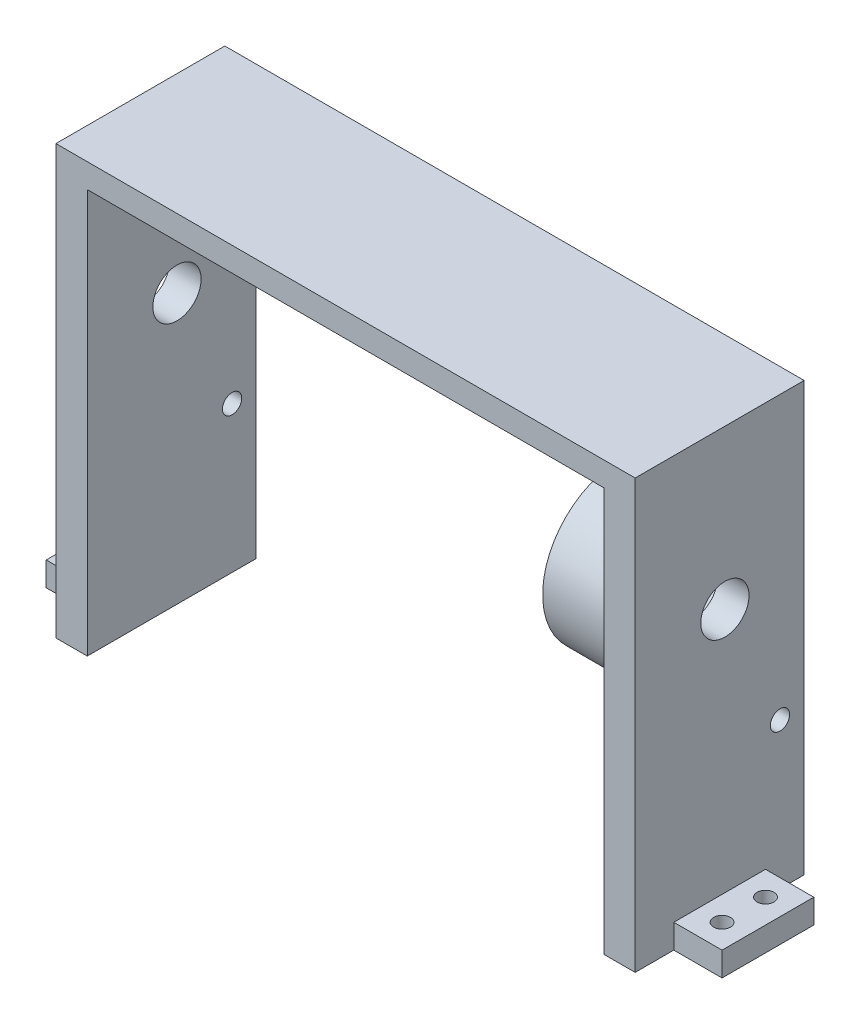
ISO-10303-21;
HEADER;
FILE_DESCRIPTION(('STEP AP214'),'2;1');
FILE_NAME('part.step','',(''),(''),'','','');
FILE_SCHEMA(('AUTOMOTIVE_DESIGN { 1 0 10303 214 1 1 1 1 }'));
ENDSEC;
DATA;
#1=APPLICATION_CONTEXT('core data for automotive mechanical design processes');
#2=APPLICATION_PROTOCOL_DEFINITION('international standard','automotive_design',2000,#1);
#3=PRODUCT_CONTEXT('',#1,'mechanical');
#4=PRODUCT('Part','Part','',(#3));
#5=PRODUCT_RELATED_PRODUCT_CATEGORY('part','',(#4));
#6=PRODUCT_DEFINITION_FORMATION('','',#4);
#7=PRODUCT_DEFINITION_CONTEXT('part definition',#1,'design');
#8=PRODUCT_DEFINITION('design','',#6,#7);
#9=PRODUCT_DEFINITION_SHAPE('','',#8);
#10=(LENGTH_UNIT() NAMED_UNIT(*) SI_UNIT(.MILLI.,.METRE.));
#11=(NAMED_UNIT(*) PLANE_ANGLE_UNIT() SI_UNIT($,.RADIAN.));
#12=(NAMED_UNIT(*) SI_UNIT($,.STERADIAN.) SOLID_ANGLE_UNIT());
#13=UNCERTAINTY_MEASURE_WITH_UNIT(LENGTH_MEASURE(1.E-05),#10,'distance_accuracy_value','');
#14=(GEOMETRIC_REPRESENTATION_CONTEXT(3) GLOBAL_UNCERTAINTY_ASSIGNED_CONTEXT((#13)) GLOBAL_UNIT_ASSIGNED_CONTEXT((#10,
#11,#12)) REPRESENTATION_CONTEXT('',''));
#15=CARTESIAN_POINT('',(0.,0.,0.));
#16=DIRECTION('',(0.,0.,1.));
#17=DIRECTION('',(1.,0.,0.));
#18=AXIS2_PLACEMENT_3D('',#15,#16,#17);
#19=CARTESIAN_POINT('',(0.,0.,0.));
#20=DIRECTION('',(1.,0.,0.));
#21=DIRECTION('',(0.,0.,-1.));
#22=AXIS2_PLACEMENT_3D('',#19,#20,#21);
#23=PLANE('',#22);
#24=CARTESIAN_POINT('',(0.,-7.31411246753193,-30.));
#25=DIRECTION('',(1.,0.,0.));
#26=DIRECTION('',(0.,0.,-1.));
#27=AXIS2_PLACEMENT_3D('',#24,#25,#26);
#28=CIRCLE('',#27,2.);
#29=CARTESIAN_POINT('',(0.,-7.31411246753193,-32.));
#30=VERTEX_POINT('',#29);
#31=EDGE_CURVE('E287',#30,#30,#28,.T.);
#32=ORIENTED_EDGE('',*,*,#31,.T.);
#33=EDGE_LOOP('',(#32));
#34=FACE_BOUND('',#33,.T.);
#35=CARTESIAN_POINT('',(0.,18.2537482407184,-18.5857764695311));
#36=DIRECTION('',(1.,0.,0.));
#37=DIRECTION('',(0.,0.,-1.));
#38=AXIS2_PLACEMENT_3D('',#35,#36,#37);
#39=CIRCLE('',#38,5.);
#40=CARTESIAN_POINT('',(0.,18.2537482407184,-23.5857764695311));
#41=VERTEX_POINT('',#40);
#42=EDGE_CURVE('E263',#41,#41,#39,.T.);
#43=ORIENTED_EDGE('',*,*,#42,.T.);
#44=EDGE_LOOP('',(#43));
#45=FACE_BOUND('',#44,.T.);
#46=DIRECTION('',(0.,-1.,0.));
#47=VECTOR('',#46,1.);
#48=CARTESIAN_POINT('',(0.,-37.6041124675319,-27.));
#49=LINE('',#48,#47);
#50=CARTESIAN_POINT('',(0.,-32.6041124675319,-27.));
#51=VERTEX_POINT('',#50);
#52=CARTESIAN_POINT('',(0.,-37.6041124675319,-27.));
#53=VERTEX_POINT('',#52);
#54=EDGE_CURVE('E51',#51,#53,#49,.T.);
#55=ORIENTED_EDGE('',*,*,#54,.F.);
#56=DIRECTION('',(0.,0.,-1.));
#57=VECTOR('',#56,1.);
#58=CARTESIAN_POINT('',(0.,-32.6041124675319,-27.));
#59=LINE('',#58,#57);
#60=CARTESIAN_POINT('',(0.,-32.6041124675319,-8.));
#61=VERTEX_POINT('',#60);
#62=EDGE_CURVE('E169',#61,#51,#59,.T.);
#63=ORIENTED_EDGE('',*,*,#62,.F.);
#64=DIRECTION('',(0.,1.,0.));
#65=VECTOR('',#64,1.);
#66=CARTESIAN_POINT('',(0.,-37.6041124675319,-8.));
#67=LINE('',#66,#65);
#68=CARTESIAN_POINT('',(0.,-37.6041124675319,-8.));
#69=VERTEX_POINT('',#68);
#70=EDGE_CURVE('E57',#69,#61,#67,.T.);
#71=ORIENTED_EDGE('',*,*,#70,.F.);
#72=DIRECTION('',(0.,0.,1.));
#73=VECTOR('',#72,1.);
#74=CARTESIAN_POINT('',(0.,-37.6041124675319,0.));
#75=LINE('',#74,#73);
#76=CARTESIAN_POINT('',(0.,-37.6041124675319,0.));
#77=VERTEX_POINT('',#76);
#78=EDGE_CURVE('E296',#69,#77,#75,.T.);
#79=ORIENTED_EDGE('',*,*,#78,.T.);
#80=DIRECTION('',(0.,-1.,0.));
#81=VECTOR('',#80,1.);
#82=CARTESIAN_POINT('',(0.,0.,0.));
#83=LINE('',#82,#81);
#84=CARTESIAN_POINT('',(0.,51.0958875324681,0.));
#85=VERTEX_POINT('',#84);
#86=EDGE_CURVE('E293',#85,#77,#83,.T.);
#87=ORIENTED_EDGE('',*,*,#86,.F.);
#88=DIRECTION('',(0.,0.,1.));
#89=VECTOR('',#88,1.);
#90=CARTESIAN_POINT('',(0.,51.0958875324681,0.));
#91=LINE('',#90,#89);
#92=CARTESIAN_POINT('',(0.,51.0958875324681,-35.));
#93=VERTEX_POINT('',#92);
#94=EDGE_CURVE('E290',#93,#85,#91,.T.);
#95=ORIENTED_EDGE('',*,*,#94,.F.);
#96=DIRECTION('',(0.,-1.,0.));
#97=VECTOR('',#96,1.);
#98=CARTESIAN_POINT('',(0.,0.,-35.));
#99=LINE('',#98,#97);
#100=CARTESIAN_POINT('',(0.,-37.6041124675319,-35.));
#101=VERTEX_POINT('',#100);
#102=EDGE_CURVE('E268',#93,#101,#99,.T.);
#103=ORIENTED_EDGE('',*,*,#102,.T.);
#104=EDGE_CURVE('E297',#101,#53,#75,.T.);
#105=ORIENTED_EDGE('',*,*,#104,.T.);
#106=EDGE_LOOP('',(#55,#63,#71,#79,#87,#95,#103,#105));
#107=FACE_BOUND('',#106,.T.);
#108=ADVANCED_FACE('F35',(#34,#45,#107),#23,.F.);
#109=CARTESIAN_POINT('',(113.5,-37.604112467532,85.));
#110=DIRECTION('',(1.,0.,0.));
#111=DIRECTION('',(0.,0.,-1.));
#112=AXIS2_PLACEMENT_3D('',#109,#110,#111);
#113=PLANE('',#112);
#114=CARTESIAN_POINT('',(113.5,18.2537482407184,-18.5857764695311));
#115=DIRECTION('',(1.,0.,0.));
#116=DIRECTION('',(0.,0.,-1.));
#117=AXIS2_PLACEMENT_3D('',#114,#115,#116);
#118=CIRCLE('',#117,5.);
#119=CARTESIAN_POINT('',(113.5,18.2537482407184,-23.5857764695311));
#120=VERTEX_POINT('',#119);
#121=EDGE_CURVE('E254',#120,#120,#118,.T.);
#122=ORIENTED_EDGE('',*,*,#121,.T.);
#123=EDGE_LOOP('',(#122));
#124=FACE_BOUND('',#123,.T.);
#125=CARTESIAN_POINT('',(113.5,18.2537482407184,-18.5857764695311));
#126=DIRECTION('',(1.,0.,0.));
#127=DIRECTION('',(0.,0.,-1.));
#128=AXIS2_PLACEMENT_3D('',#125,#126,#127);
#129=CIRCLE('',#128,14.);
#130=CARTESIAN_POINT('',(113.5,18.2537482407184,-32.5857764695311));
#131=VERTEX_POINT('',#130);
#132=EDGE_CURVE('E11',#131,#131,#129,.T.);
#133=ORIENTED_EDGE('',*,*,#132,.F.);
#134=EDGE_LOOP('',(#133));
#135=FACE_BOUND('',#134,.T.);
#136=ADVANCED_FACE('F371',(#124,#135),#113,.F.);
#137=CARTESIAN_POINT('',(120.,-37.6041124675319,0.));
#138=DIRECTION('',(0.,-1.,0.));
#139=DIRECTION('',(0.,0.,-1.));
#140=AXIS2_PLACEMENT_3D('',#137,#138,#139);
#141=PLANE('',#140);
#142=CARTESIAN_POINT('',(125.,-37.6041124675319,-22.));
#143=DIRECTION('',(0.,-1.,0.));
#144=DIRECTION('',(0.,0.,-1.));
#145=AXIS2_PLACEMENT_3D('',#142,#143,#144);
#146=CIRCLE('',#145,1.75000000000001);
#147=CARTESIAN_POINT('',(125.,-37.6041124675319,-23.75));
#148=VERTEX_POINT('',#147);
#149=EDGE_CURVE('E186',#148,#148,#146,.T.);
#150=ORIENTED_EDGE('',*,*,#149,.F.);
#151=EDGE_LOOP('',(#150));
#152=FACE_BOUND('',#151,.T.);
#153=CARTESIAN_POINT('',(125.,-37.6041124675319,-13.));
#154=DIRECTION('',(0.,-1.,0.));
#155=DIRECTION('',(0.,0.,-1.));
#156=AXIS2_PLACEMENT_3D('',#153,#154,#155);
#157=CIRCLE('',#156,1.75000000000001);
#158=CARTESIAN_POINT('',(125.,-37.6041124675319,-14.75));
#159=VERTEX_POINT('',#158);
#160=EDGE_CURVE('E182',#159,#159,#157,.T.);
#161=ORIENTED_EDGE('',*,*,#160,.F.);
#162=EDGE_LOOP('',(#161));
#163=FACE_BOUND('',#162,.T.);
#164=DIRECTION('',(0.,0.,-1.));
#165=VECTOR('',#164,1.);
#166=CARTESIAN_POINT('',(113.5,-37.604112467532,85.));
#167=LINE('',#166,#165);
#168=CARTESIAN_POINT('',(113.5,-37.6041124675319,0.));
#169=VERTEX_POINT('',#168);
#170=CARTESIAN_POINT('',(113.5,-37.6041124675319,-35.));
#171=VERTEX_POINT('',#170);
#172=EDGE_CURVE('E233',#169,#171,#167,.T.);
#173=ORIENTED_EDGE('',*,*,#172,.T.);
#174=DIRECTION('',(-1.,0.,0.));
#175=VECTOR('',#174,1.);
#176=CARTESIAN_POINT('',(120.,-37.6041124675319,-35.));
#177=LINE('',#176,#175);
#178=CARTESIAN_POINT('',(120.,-37.6041124675319,-35.));
#179=VERTEX_POINT('',#178);
#180=EDGE_CURVE('E303',#179,#171,#177,.T.);
#181=ORIENTED_EDGE('',*,*,#180,.F.);
#182=DIRECTION('',(0.,0.,1.));
#183=VECTOR('',#182,1.);
#184=CARTESIAN_POINT('',(120.,-37.6041124675319,0.));
#185=LINE('',#184,#183);
#186=CARTESIAN_POINT('',(120.,-37.6041124675319,-27.));
#187=VERTEX_POINT('',#186);
#188=EDGE_CURVE('E278',#179,#187,#185,.T.);
#189=ORIENTED_EDGE('',*,*,#188,.T.);
#190=DIRECTION('',(-1.,0.,0.));
#191=VECTOR('',#190,1.);
#192=CARTESIAN_POINT('',(130.,-37.6041124675319,-27.));
#193=LINE('',#192,#191);
#194=CARTESIAN_POINT('',(130.,-37.6041124675319,-27.));
#195=VERTEX_POINT('',#194);
#196=EDGE_CURVE('E213',#195,#187,#193,.T.);
#197=ORIENTED_EDGE('',*,*,#196,.F.);
#198=DIRECTION('',(0.,0.,-1.));
#199=VECTOR('',#198,1.);
#200=CARTESIAN_POINT('',(130.,-37.6041124675319,-8.));
#201=LINE('',#200,#199);
#202=CARTESIAN_POINT('',(130.,-37.6041124675319,-8.));
#203=VERTEX_POINT('',#202);
#204=EDGE_CURVE('E193',#203,#195,#201,.T.);
#205=ORIENTED_EDGE('',*,*,#204,.F.);
#206=DIRECTION('',(-1.,0.,0.));
#207=VECTOR('',#206,1.);
#208=CARTESIAN_POINT('',(130.,-37.6041124675319,-8.));
#209=LINE('',#208,#207);
#210=CARTESIAN_POINT('',(120.,-37.6041124675319,-8.));
#211=VERTEX_POINT('',#210);
#212=EDGE_CURVE('E216',#203,#211,#209,.T.);
#213=ORIENTED_EDGE('',*,*,#212,.T.);
#214=CARTESIAN_POINT('',(120.,-37.6041124675319,0.));
#215=VERTEX_POINT('',#214);
#216=EDGE_CURVE('E277',#211,#215,#185,.T.);
#217=ORIENTED_EDGE('',*,*,#216,.T.);
#218=DIRECTION('',(-1.,0.,0.));
#219=VECTOR('',#218,1.);
#220=CARTESIAN_POINT('',(120.,-37.6041124675319,0.));
#221=LINE('',#220,#219);
#222=EDGE_CURVE('E307',#215,#169,#221,.T.);
#223=ORIENTED_EDGE('',*,*,#222,.T.);
#224=EDGE_LOOP('',(#173,#181,#189,#197,#205,#213,#217,#223));
#225=FACE_BOUND('',#224,.T.);
#226=ADVANCED_FACE('F337',(#152,#163,#225),#141,.T.);
#227=CARTESIAN_POINT('',(120.,-7.31411246753193,-30.));
#228=DIRECTION('',(-1.,0.,0.));
#229=DIRECTION('',(0.,0.,1.));
#230=AXIS2_PLACEMENT_3D('',#227,#228,#229);
#231=CYLINDRICAL_SURFACE('',#230,2.);
#232=CARTESIAN_POINT('',(113.5,-7.31411246753193,-30.));
#233=DIRECTION('',(1.,0.,0.));
#234=DIRECTION('',(0.,0.,-1.));
#235=AXIS2_PLACEMENT_3D('',#232,#233,#234);
#236=CIRCLE('',#235,2.);
#237=CARTESIAN_POINT('',(113.5,-7.31411246753193,-32.));
#238=VERTEX_POINT('',#237);
#239=EDGE_CURVE('E257',#238,#238,#236,.T.);
#240=ORIENTED_EDGE('',*,*,#239,.F.);
#241=EDGE_LOOP('',(#240));
#242=FACE_BOUND('',#241,.T.);
#243=CARTESIAN_POINT('',(120.,-7.31411246753193,-30.));
#244=DIRECTION('',(1.,0.,0.));
#245=DIRECTION('',(0.,0.,-1.));
#246=AXIS2_PLACEMENT_3D('',#243,#244,#245);
#247=CIRCLE('',#246,2.);
#248=CARTESIAN_POINT('',(120.,-7.31411246753193,-32.));
#249=VERTEX_POINT('',#248);
#250=EDGE_CURVE('E267',#249,#249,#247,.T.);
#251=ORIENTED_EDGE('',*,*,#250,.T.);
#252=EDGE_LOOP('',(#251));
#253=FACE_BOUND('',#252,.T.);
#254=ADVANCED_FACE('F394',(#242,#253),#231,.F.);
#255=CARTESIAN_POINT('',(120.,18.2537482407184,-18.5857764695311));
#256=DIRECTION('',(-1.,0.,0.));
#257=DIRECTION('',(0.,0.,1.));
#258=AXIS2_PLACEMENT_3D('',#255,#256,#257);
#259=CYLINDRICAL_SURFACE('',#258,5.);
#260=ORIENTED_EDGE('',*,*,#121,.F.);
#261=EDGE_LOOP('',(#260));
#262=FACE_BOUND('',#261,.T.);
#263=CARTESIAN_POINT('',(120.,18.2537482407184,-18.5857764695311));
#264=DIRECTION('',(1.,0.,0.));
#265=DIRECTION('',(0.,0.,-1.));
#266=AXIS2_PLACEMENT_3D('',#263,#264,#265);
#267=CIRCLE('',#266,5.);
#268=CARTESIAN_POINT('',(120.,18.2537482407184,-23.5857764695311));
#269=VERTEX_POINT('',#268);
#270=EDGE_CURVE('E264',#269,#269,#267,.T.);
#271=ORIENTED_EDGE('',*,*,#270,.T.);
#272=EDGE_LOOP('',(#271));
#273=FACE_BOUND('',#272,.T.);
#274=ADVANCED_FACE('F391',(#262,#273),#259,.F.);
#275=CARTESIAN_POINT('',(120.,51.0958875324681,0.));
#276=DIRECTION('',(0.,-1.,0.));
#277=DIRECTION('',(0.,0.,-1.));
#278=AXIS2_PLACEMENT_3D('',#275,#276,#277);
#279=PLANE('',#278);
#280=ORIENTED_EDGE('',*,*,#94,.T.);
#281=DIRECTION('',(-1.,0.,0.));
#282=VECTOR('',#281,1.);
#283=CARTESIAN_POINT('',(120.,51.0958875324681,0.));
#284=LINE('',#283,#282);
#285=CARTESIAN_POINT('',(120.,51.0958875324681,0.));
#286=VERTEX_POINT('',#285);
#287=EDGE_CURVE('E44',#286,#85,#284,.T.);
#288=ORIENTED_EDGE('',*,*,#287,.F.);
#289=DIRECTION('',(0.,0.,1.));
#290=VECTOR('',#289,1.);
#291=CARTESIAN_POINT('',(120.,51.0958875324681,0.));
#292=LINE('',#291,#290);
#293=CARTESIAN_POINT('',(120.,51.0958875324681,-35.));
#294=VERTEX_POINT('',#293);
#295=EDGE_CURVE('E271',#294,#286,#292,.T.);
#296=ORIENTED_EDGE('',*,*,#295,.F.);
#297=DIRECTION('',(-1.,0.,0.));
#298=VECTOR('',#297,1.);
#299=CARTESIAN_POINT('',(120.,51.0958875324681,-35.));
#300=LINE('',#299,#298);
#301=EDGE_CURVE('E284',#294,#93,#300,.T.);
#302=ORIENTED_EDGE('',*,*,#301,.T.);
#303=EDGE_LOOP('',(#280,#288,#296,#302));
#304=FACE_BOUND('',#303,.T.);
#305=ADVANCED_FACE('F319',(#304),#279,.F.);
#306=CARTESIAN_POINT('',(120.,0.,0.));
#307=DIRECTION('',(0.,0.,-1.));
#308=DIRECTION('',(0.,1.,0.));
#309=AXIS2_PLACEMENT_3D('',#306,#307,#308);
#310=PLANE('',#309);
#311=DIRECTION('',(1.,0.,0.));
#312=VECTOR('',#311,1.);
#313=CARTESIAN_POINT('',(120.,46.0958875324681,0.));
#314=LINE('',#313,#312);
#315=CARTESIAN_POINT('',(6.50000000000001,46.0958875324681,0.));
#316=VERTEX_POINT('',#315);
#317=CARTESIAN_POINT('',(113.5,46.0958875324681,0.));
#318=VERTEX_POINT('',#317);
#319=EDGE_CURVE('E251',#316,#318,#314,.T.);
#320=ORIENTED_EDGE('',*,*,#319,.T.);
#321=DIRECTION('',(0.,-1.,0.));
#322=VECTOR('',#321,1.);
#323=CARTESIAN_POINT('',(113.5,0.,0.));
#324=LINE('',#323,#322);
#325=EDGE_CURVE('E260',#318,#169,#324,.T.);
#326=ORIENTED_EDGE('',*,*,#325,.T.);
#327=ORIENTED_EDGE('',*,*,#222,.F.);
#328=DIRECTION('',(0.,-1.,0.));
#329=VECTOR('',#328,1.);
#330=CARTESIAN_POINT('',(120.,0.,0.));
#331=LINE('',#330,#329);
#332=EDGE_CURVE('E274',#286,#215,#331,.T.);
#333=ORIENTED_EDGE('',*,*,#332,.F.);
#334=ORIENTED_EDGE('',*,*,#287,.T.);
#335=ORIENTED_EDGE('',*,*,#86,.T.);
#336=CARTESIAN_POINT('',(6.50000000000001,-37.6041124675319,0.));
#337=VERTEX_POINT('',#336);
#338=EDGE_CURVE('E306',#337,#77,#221,.T.);
#339=ORIENTED_EDGE('',*,*,#338,.F.);
#340=DIRECTION('',(0.,1.,0.));
#341=VECTOR('',#340,1.);
#342=CARTESIAN_POINT('',(6.50000000000001,0.,0.));
#343=LINE('',#342,#341);
#344=EDGE_CURVE('E248',#337,#316,#343,.T.);
#345=ORIENTED_EDGE('',*,*,#344,.T.);
#346=EDGE_LOOP('',(#320,#326,#327,#333,#334,#335,#339,#345));
#347=FACE_BOUND('',#346,.T.);
#348=ADVANCED_FACE('F313',(#347),#310,.F.);
#349=CARTESIAN_POINT('',(-5.,-37.6041124675319,-22.));
#350=DIRECTION('',(0.,1.,0.));
#351=DIRECTION('',(0.,0.,1.));
#352=AXIS2_PLACEMENT_3D('',#349,#350,#351);
#353=CIRCLE('',#352,1.97507745441932);
#354=CARTESIAN_POINT('',(-5.,-37.6041124675319,-20.0249225455807));
#355=VERTEX_POINT('',#354);
#356=EDGE_CURVE('E562',#355,#355,#353,.T.);
#357=ORIENTED_EDGE('',*,*,#356,.T.);
#358=EDGE_LOOP('',(#357));
#359=FACE_BOUND('',#358,.T.);
#360=CARTESIAN_POINT('',(-5.,-37.6041124675319,-13.));
#361=DIRECTION('',(0.,1.,0.));
#362=DIRECTION('',(0.,0.,1.));
#363=AXIS2_PLACEMENT_3D('',#360,#361,#362);
#364=CIRCLE('',#363,2.12547973703722);
#365=CARTESIAN_POINT('',(-5.,-37.6041124675319,-10.8745202629628));
#366=VERTEX_POINT('',#365);
#367=EDGE_CURVE('E566',#366,#366,#364,.T.);
#368=ORIENTED_EDGE('',*,*,#367,.T.);
#369=EDGE_LOOP('',(#368));
#370=FACE_BOUND('',#369,.T.);
#371=DIRECTION('',(0.,0.,-1.));
#372=VECTOR('',#371,1.);
#373=CARTESIAN_POINT('',(6.50000000000001,-37.604112467532,85.));
#374=LINE('',#373,#372);
#375=CARTESIAN_POINT('',(6.50000000000001,-37.6041124675319,-35.));
#376=VERTEX_POINT('',#375);
#377=EDGE_CURVE('E239',#337,#376,#374,.T.);
#378=ORIENTED_EDGE('',*,*,#377,.F.);
#379=ORIENTED_EDGE('',*,*,#338,.T.);
#380=ORIENTED_EDGE('',*,*,#78,.F.);
#381=DIRECTION('',(1.,0.,0.));
#382=VECTOR('',#381,1.);
#383=CARTESIAN_POINT('',(-10.,-37.6041124675319,-8.));
#384=LINE('',#383,#382);
#385=CARTESIAN_POINT('',(-10.,-37.6041124675319,-8.));
#386=VERTEX_POINT('',#385);
#387=EDGE_CURVE('E156',#386,#69,#384,.T.);
#388=ORIENTED_EDGE('',*,*,#387,.F.);
#389=DIRECTION('',(0.,0.,1.));
#390=VECTOR('',#389,1.);
#391=CARTESIAN_POINT('',(-10.,-37.6041124675319,-27.));
#392=LINE('',#391,#390);
#393=CARTESIAN_POINT('',(-10.,-37.6041124675319,-27.));
#394=VERTEX_POINT('',#393);
#395=EDGE_CURVE('E148',#394,#386,#392,.T.);
#396=ORIENTED_EDGE('',*,*,#395,.F.);
#397=DIRECTION('',(1.,0.,0.));
#398=VECTOR('',#397,1.);
#399=CARTESIAN_POINT('',(-10.,-37.6041124675319,-27.));
#400=LINE('',#399,#398);
#401=EDGE_CURVE('E154',#394,#53,#400,.T.);
#402=ORIENTED_EDGE('',*,*,#401,.T.);
#403=ORIENTED_EDGE('',*,*,#104,.F.);
#404=EDGE_CURVE('E302',#376,#101,#177,.T.);
#405=ORIENTED_EDGE('',*,*,#404,.F.);
#406=EDGE_LOOP('',(#378,#379,#380,#388,#396,#402,#403,#405));
#407=FACE_BOUND('',#406,.T.);
#408=ADVANCED_FACE('F151',(#359,#370,#407),#141,.T.);
#409=CARTESIAN_POINT('',(6.50000000000001,-7.31411246753193,-30.));
#410=DIRECTION('',(-1.,0.,0.));
#411=DIRECTION('',(0.,0.,1.));
#412=AXIS2_PLACEMENT_3D('',#409,#410,#411);
#413=CIRCLE('',#412,2.);
#414=CARTESIAN_POINT('',(6.50000000000001,-7.31411246753193,-28.));
#415=VERTEX_POINT('',#414);
#416=EDGE_CURVE('E245',#415,#415,#413,.T.);
#417=ORIENTED_EDGE('',*,*,#416,.F.);
#418=EDGE_LOOP('',(#417));
#419=FACE_BOUND('',#418,.T.);
#420=ORIENTED_EDGE('',*,*,#31,.F.);
#421=EDGE_LOOP('',(#420));
#422=FACE_BOUND('',#421,.T.);
#423=ADVANCED_FACE('F386',(#419,#422),#231,.F.);
#424=CARTESIAN_POINT('',(6.50000000000001,18.2537482407184,-18.5857764695311));
#425=DIRECTION('',(-1.,0.,0.));
#426=DIRECTION('',(0.,0.,1.));
#427=AXIS2_PLACEMENT_3D('',#424,#425,#426);
#428=CIRCLE('',#427,5.);
#429=CARTESIAN_POINT('',(6.50000000000001,18.2537482407184,-13.5857764695311));
#430=VERTEX_POINT('',#429);
#431=EDGE_CURVE('E236',#430,#430,#428,.T.);
#432=ORIENTED_EDGE('',*,*,#431,.F.);
#433=EDGE_LOOP('',(#432));
#434=FACE_BOUND('',#433,.T.);
#435=ORIENTED_EDGE('',*,*,#42,.F.);
#436=EDGE_LOOP('',(#435));
#437=FACE_BOUND('',#436,.T.);
#438=ADVANCED_FACE('F37',(#434,#437),#259,.F.);
#439=CARTESIAN_POINT('',(120.,0.,-35.));
#440=DIRECTION('',(0.,0.,-1.));
#441=DIRECTION('',(0.,1.,0.));
#442=AXIS2_PLACEMENT_3D('',#439,#440,#441);
#443=PLANE('',#442);
#444=DIRECTION('',(0.,-1.,0.));
#445=VECTOR('',#444,1.);
#446=CARTESIAN_POINT('',(113.5,-37.6041124675319,-35.));
#447=LINE('',#446,#445);
#448=CARTESIAN_POINT('',(113.5,46.0958875324681,-35.));
#449=VERTEX_POINT('',#448);
#450=EDGE_CURVE('E225',#449,#171,#447,.T.);
#451=ORIENTED_EDGE('',*,*,#450,.F.);
#452=DIRECTION('',(1.,0.,0.));
#453=VECTOR('',#452,1.);
#454=CARTESIAN_POINT('',(113.5,46.0958875324681,-35.));
#455=LINE('',#454,#453);
#456=CARTESIAN_POINT('',(6.50000000000001,46.0958875324681,-35.));
#457=VERTEX_POINT('',#456);
#458=EDGE_CURVE('E230',#457,#449,#455,.T.);
#459=ORIENTED_EDGE('',*,*,#458,.F.);
#460=DIRECTION('',(0.,1.,0.));
#461=VECTOR('',#460,1.);
#462=CARTESIAN_POINT('',(6.50000000000001,-37.6041124675319,-35.));
#463=LINE('',#462,#461);
#464=EDGE_CURVE('E227',#376,#457,#463,.T.);
#465=ORIENTED_EDGE('',*,*,#464,.F.);
#466=ORIENTED_EDGE('',*,*,#404,.T.);
#467=ORIENTED_EDGE('',*,*,#102,.F.);
#468=ORIENTED_EDGE('',*,*,#301,.F.);
#469=DIRECTION('',(0.,-1.,0.));
#470=VECTOR('',#469,1.);
#471=CARTESIAN_POINT('',(120.,0.,-35.));
#472=LINE('',#471,#470);
#473=EDGE_CURVE('E281',#294,#179,#472,.T.);
#474=ORIENTED_EDGE('',*,*,#473,.T.);
#475=ORIENTED_EDGE('',*,*,#180,.T.);
#476=EDGE_LOOP('',(#451,#459,#465,#466,#467,#468,#474,#475));
#477=FACE_BOUND('',#476,.T.);
#478=ADVANCED_FACE('F323',(#477),#443,.T.);
#479=CARTESIAN_POINT('',(120.,0.,0.));
#480=DIRECTION('',(1.,0.,0.));
#481=DIRECTION('',(0.,0.,-1.));
#482=AXIS2_PLACEMENT_3D('',#479,#480,#481);
#483=PLANE('',#482);
#484=DIRECTION('',(0.,-1.,0.));
#485=VECTOR('',#484,1.);
#486=CARTESIAN_POINT('',(120.,-37.6041124675319,-8.));
#487=LINE('',#486,#485);
#488=CARTESIAN_POINT('',(120.,-32.6041124675319,-8.));
#489=VERTEX_POINT('',#488);
#490=EDGE_CURVE('E189',#489,#211,#487,.T.);
#491=ORIENTED_EDGE('',*,*,#490,.F.);
#492=DIRECTION('',(0.,0.,1.));
#493=VECTOR('',#492,1.);
#494=CARTESIAN_POINT('',(120.,-32.6041124675319,-8.));
#495=LINE('',#494,#493);
#496=CARTESIAN_POINT('',(120.,-32.6041124675319,-27.));
#497=VERTEX_POINT('',#496);
#498=EDGE_CURVE('E194',#497,#489,#495,.T.);
#499=ORIENTED_EDGE('',*,*,#498,.F.);
#500=DIRECTION('',(0.,1.,0.));
#501=VECTOR('',#500,1.);
#502=CARTESIAN_POINT('',(120.,-37.6041124675319,-27.));
#503=LINE('',#502,#501);
#504=EDGE_CURVE('E203',#187,#497,#503,.T.);
#505=ORIENTED_EDGE('',*,*,#504,.F.);
#506=ORIENTED_EDGE('',*,*,#188,.F.);
#507=ORIENTED_EDGE('',*,*,#473,.F.);
#508=ORIENTED_EDGE('',*,*,#295,.T.);
#509=ORIENTED_EDGE('',*,*,#332,.T.);
#510=ORIENTED_EDGE('',*,*,#216,.F.);
#511=EDGE_LOOP('',(#491,#499,#505,#506,#507,#508,#509,#510));
#512=FACE_BOUND('',#511,.T.);
#513=ORIENTED_EDGE('',*,*,#250,.F.);
#514=EDGE_LOOP('',(#513));
#515=FACE_BOUND('',#514,.T.);
#516=ORIENTED_EDGE('',*,*,#270,.F.);
#517=EDGE_LOOP('',(#516));
#518=FACE_BOUND('',#517,.T.);
#519=ADVANCED_FACE('F340',(#512,#515,#518),#483,.T.);
#520=CARTESIAN_POINT('',(113.5,18.2537482407184,-18.5857764695311));
#521=DIRECTION('',(1.,0.,0.));
#522=DIRECTION('',(0.,0.,-1.));
#523=AXIS2_PLACEMENT_3D('',#520,#521,#522);
#524=CIRCLE('',#523,16.25);
#525=CARTESIAN_POINT('',(113.5,18.2537482407184,-34.8357764695311));
#526=VERTEX_POINT('',#525);
#527=EDGE_CURVE('E39',#526,#526,#524,.T.);
#528=ORIENTED_EDGE('',*,*,#527,.T.);
#529=EDGE_LOOP('',(#528));
#530=FACE_BOUND('',#529,.T.);
#531=ORIENTED_EDGE('',*,*,#239,.T.);
#532=EDGE_LOOP('',(#531));
#533=FACE_BOUND('',#532,.T.);
#534=DIRECTION('',(0.,0.,-1.));
#535=VECTOR('',#534,1.);
#536=CARTESIAN_POINT('',(113.5,46.095887532468,85.));
#537=LINE('',#536,#535);
#538=EDGE_CURVE('E234',#318,#449,#537,.T.);
#539=ORIENTED_EDGE('',*,*,#538,.T.);
#540=ORIENTED_EDGE('',*,*,#450,.T.);
#541=ORIENTED_EDGE('',*,*,#172,.F.);
#542=ORIENTED_EDGE('',*,*,#325,.F.);
#543=EDGE_LOOP('',(#539,#540,#541,#542));
#544=FACE_BOUND('',#543,.T.);
#545=ADVANCED_FACE('F335',(#530,#533,#544),#113,.F.);
#546=CARTESIAN_POINT('',(113.5,46.095887532468,85.));
#547=DIRECTION('',(0.,1.,0.));
#548=DIRECTION('',(0.,0.,1.));
#549=AXIS2_PLACEMENT_3D('',#546,#547,#548);
#550=PLANE('',#549);
#551=DIRECTION('',(0.,0.,-1.));
#552=VECTOR('',#551,1.);
#553=CARTESIAN_POINT('',(6.50000000000001,46.095887532468,85.));
#554=LINE('',#553,#552);
#555=EDGE_CURVE('E237',#316,#457,#554,.T.);
#556=ORIENTED_EDGE('',*,*,#555,.T.);
#557=ORIENTED_EDGE('',*,*,#458,.T.);
#558=ORIENTED_EDGE('',*,*,#538,.F.);
#559=ORIENTED_EDGE('',*,*,#319,.F.);
#560=EDGE_LOOP('',(#556,#557,#558,#559));
#561=FACE_BOUND('',#560,.T.);
#562=ADVANCED_FACE('F332',(#561),#550,.F.);
#563=CARTESIAN_POINT('',(6.50000000000001,-37.604112467532,85.));
#564=DIRECTION('',(-1.,0.,0.));
#565=DIRECTION('',(0.,0.,1.));
#566=AXIS2_PLACEMENT_3D('',#563,#564,#565);
#567=PLANE('',#566);
#568=ORIENTED_EDGE('',*,*,#416,.T.);
#569=EDGE_LOOP('',(#568));
#570=FACE_BOUND('',#569,.T.);
#571=ORIENTED_EDGE('',*,*,#431,.T.);
#572=EDGE_LOOP('',(#571));
#573=FACE_BOUND('',#572,.T.);
#574=ORIENTED_EDGE('',*,*,#377,.T.);
#575=ORIENTED_EDGE('',*,*,#464,.T.);
#576=ORIENTED_EDGE('',*,*,#555,.F.);
#577=ORIENTED_EDGE('',*,*,#344,.F.);
#578=EDGE_LOOP('',(#574,#575,#576,#577));
#579=FACE_BOUND('',#578,.T.);
#580=ADVANCED_FACE('F330',(#570,#573,#579),#567,.F.);
#581=CARTESIAN_POINT('',(98.5,18.2537482407184,-18.5857764695311));
#582=DIRECTION('',(1.,0.,0.));
#583=DIRECTION('',(0.,0.,-1.));
#584=AXIS2_PLACEMENT_3D('',#581,#582,#583);
#585=CYLINDRICAL_SURFACE('',#584,16.25);
#586=CARTESIAN_POINT('',(98.5,18.2537482407184,-18.5857764695311));
#587=DIRECTION('',(1.,0.,0.));
#588=DIRECTION('',(0.,0.,-1.));
#589=AXIS2_PLACEMENT_3D('',#586,#587,#588);
#590=CIRCLE('',#589,16.25);
#591=CARTESIAN_POINT('',(98.5,18.2537482407184,-34.8357764695311));
#592=VERTEX_POINT('',#591);
#593=EDGE_CURVE('E222',#592,#592,#590,.T.);
#594=ORIENTED_EDGE('',*,*,#593,.T.);
#595=EDGE_LOOP('',(#594));
#596=FACE_BOUND('',#595,.T.);
#597=ORIENTED_EDGE('',*,*,#527,.F.);
#598=EDGE_LOOP('',(#597));
#599=FACE_BOUND('',#598,.T.);
#600=ADVANCED_FACE('F428',(#596,#599),#585,.T.);
#601=CARTESIAN_POINT('',(98.5,18.2537482407184,-18.5857764695311));
#602=DIRECTION('',(1.,0.,0.));
#603=DIRECTION('',(0.,0.,-1.));
#604=AXIS2_PLACEMENT_3D('',#601,#602,#603);
#605=CYLINDRICAL_SURFACE('',#604,14.);
#606=CARTESIAN_POINT('',(98.5,18.2537482407184,-18.5857764695311));
#607=DIRECTION('',(1.,0.,0.));
#608=DIRECTION('',(0.,0.,-1.));
#609=AXIS2_PLACEMENT_3D('',#606,#607,#608);
#610=CIRCLE('',#609,14.);
#611=CARTESIAN_POINT('',(98.5,18.2537482407184,-32.5857764695311));
#612=VERTEX_POINT('',#611);
#613=EDGE_CURVE('E219',#612,#612,#610,.T.);
#614=ORIENTED_EDGE('',*,*,#613,.F.);
#615=EDGE_LOOP('',(#614));
#616=FACE_BOUND('',#615,.T.);
#617=ORIENTED_EDGE('',*,*,#132,.T.);
#618=EDGE_LOOP('',(#617));
#619=FACE_BOUND('',#618,.T.);
#620=ADVANCED_FACE('F433',(#616,#619),#605,.F.);
#621=CARTESIAN_POINT('',(98.5,18.2537482407184,-18.5857764695311));
#622=DIRECTION('',(1.,0.,0.));
#623=DIRECTION('',(0.,0.,-1.));
#624=AXIS2_PLACEMENT_3D('',#621,#622,#623);
#625=PLANE('',#624);
#626=ORIENTED_EDGE('',*,*,#613,.T.);
#627=EDGE_LOOP('',(#626));
#628=FACE_BOUND('',#627,.T.);
#629=ORIENTED_EDGE('',*,*,#593,.F.);
#630=EDGE_LOOP('',(#629));
#631=FACE_BOUND('',#630,.T.);
#632=ADVANCED_FACE('F435',(#628,#631),#625,.F.);
#633=CARTESIAN_POINT('',(130.,-37.6041124675319,-8.));
#634=DIRECTION('',(0.,0.,-1.));
#635=DIRECTION('',(-1.,0.,0.));
#636=AXIS2_PLACEMENT_3D('',#633,#634,#635);
#637=PLANE('',#636);
#638=ORIENTED_EDGE('',*,*,#490,.T.);
#639=ORIENTED_EDGE('',*,*,#212,.F.);
#640=DIRECTION('',(0.,-1.,0.));
#641=VECTOR('',#640,1.);
#642=CARTESIAN_POINT('',(130.,-37.6041124675319,-8.));
#643=LINE('',#642,#641);
#644=CARTESIAN_POINT('',(130.,-32.6041124675319,-8.));
#645=VERTEX_POINT('',#644);
#646=EDGE_CURVE('E190',#645,#203,#643,.T.);
#647=ORIENTED_EDGE('',*,*,#646,.F.);
#648=DIRECTION('',(-1.,0.,0.));
#649=VECTOR('',#648,1.);
#650=CARTESIAN_POINT('',(130.,-32.6041124675319,-8.));
#651=LINE('',#650,#649);
#652=EDGE_CURVE('E200',#645,#489,#651,.T.);
#653=ORIENTED_EDGE('',*,*,#652,.T.);
#654=EDGE_LOOP('',(#638,#639,#647,#653));
#655=FACE_BOUND('',#654,.T.);
#656=ADVANCED_FACE('F355',(#655),#637,.F.);
#657=CARTESIAN_POINT('',(130.,-37.6041124675319,-27.));
#658=DIRECTION('',(0.,0.,1.));
#659=DIRECTION('',(1.,0.,0.));
#660=AXIS2_PLACEMENT_3D('',#657,#658,#659);
#661=PLANE('',#660);
#662=ORIENTED_EDGE('',*,*,#504,.T.);
#663=DIRECTION('',(-1.,0.,0.));
#664=VECTOR('',#663,1.);
#665=CARTESIAN_POINT('',(130.,-32.6041124675319,-27.));
#666=LINE('',#665,#664);
#667=CARTESIAN_POINT('',(130.,-32.6041124675319,-27.));
#668=VERTEX_POINT('',#667);
#669=EDGE_CURVE('E210',#668,#497,#666,.T.);
#670=ORIENTED_EDGE('',*,*,#669,.F.);
#671=DIRECTION('',(0.,1.,0.));
#672=VECTOR('',#671,1.);
#673=CARTESIAN_POINT('',(130.,-37.6041124675319,-27.));
#674=LINE('',#673,#672);
#675=EDGE_CURVE('E196',#195,#668,#674,.T.);
#676=ORIENTED_EDGE('',*,*,#675,.F.);
#677=ORIENTED_EDGE('',*,*,#196,.T.);
#678=EDGE_LOOP('',(#662,#670,#676,#677));
#679=FACE_BOUND('',#678,.T.);
#680=ADVANCED_FACE('F347',(#679),#661,.F.);
#681=CARTESIAN_POINT('',(130.,-32.6041124675319,-8.));
#682=DIRECTION('',(0.,-1.,0.));
#683=DIRECTION('',(0.,0.,-1.));
#684=AXIS2_PLACEMENT_3D('',#681,#682,#683);
#685=PLANE('',#684);
#686=CARTESIAN_POINT('',(125.,-32.6041124675319,-22.));
#687=DIRECTION('',(0.,1.,0.));
#688=DIRECTION('',(0.,0.,1.));
#689=AXIS2_PLACEMENT_3D('',#686,#687,#688);
#690=CIRCLE('',#689,1.75000000000001);
#691=CARTESIAN_POINT('',(125.,-32.6041124675319,-20.25));
#692=VERTEX_POINT('',#691);
#693=EDGE_CURVE('E175',#692,#692,#690,.T.);
#694=ORIENTED_EDGE('',*,*,#693,.F.);
#695=EDGE_LOOP('',(#694));
#696=FACE_BOUND('',#695,.T.);
#697=CARTESIAN_POINT('',(125.,-32.6041124675319,-13.));
#698=DIRECTION('',(0.,1.,0.));
#699=DIRECTION('',(0.,0.,1.));
#700=AXIS2_PLACEMENT_3D('',#697,#698,#699);
#701=CIRCLE('',#700,1.75000000000001);
#702=CARTESIAN_POINT('',(125.,-32.6041124675319,-11.25));
#703=VERTEX_POINT('',#702);
#704=EDGE_CURVE('E172',#703,#703,#701,.T.);
#705=ORIENTED_EDGE('',*,*,#704,.F.);
#706=EDGE_LOOP('',(#705));
#707=FACE_BOUND('',#706,.T.);
#708=ORIENTED_EDGE('',*,*,#498,.T.);
#709=ORIENTED_EDGE('',*,*,#652,.F.);
#710=DIRECTION('',(0.,0.,1.));
#711=VECTOR('',#710,1.);
#712=CARTESIAN_POINT('',(130.,-32.6041124675319,-8.));
#713=LINE('',#712,#711);
#714=EDGE_CURVE('E198',#668,#645,#713,.T.);
#715=ORIENTED_EDGE('',*,*,#714,.F.);
#716=ORIENTED_EDGE('',*,*,#669,.T.);
#717=EDGE_LOOP('',(#708,#709,#715,#716));
#718=FACE_BOUND('',#717,.T.);
#719=ADVANCED_FACE('F357',(#696,#707,#718),#685,.F.);
#720=CARTESIAN_POINT('',(130.,0.,0.));
#721=DIRECTION('',(-1.,0.,0.));
#722=DIRECTION('',(0.,0.,1.));
#723=AXIS2_PLACEMENT_3D('',#720,#721,#722);
#724=PLANE('',#723);
#725=ORIENTED_EDGE('',*,*,#646,.T.);
#726=ORIENTED_EDGE('',*,*,#204,.T.);
#727=ORIENTED_EDGE('',*,*,#675,.T.);
#728=ORIENTED_EDGE('',*,*,#714,.T.);
#729=EDGE_LOOP('',(#725,#726,#727,#728));
#730=FACE_BOUND('',#729,.T.);
#731=ADVANCED_FACE('F351',(#730),#724,.F.);
#732=CARTESIAN_POINT('',(125.,-42.6041124675319,-13.));
#733=DIRECTION('',(0.,1.,0.));
#734=DIRECTION('',(0.,0.,1.));
#735=AXIS2_PLACEMENT_3D('',#732,#733,#734);
#736=CYLINDRICAL_SURFACE('',#735,1.75000000000001);
#737=ORIENTED_EDGE('',*,*,#160,.T.);
#738=EDGE_LOOP('',(#737));
#739=FACE_BOUND('',#738,.T.);
#740=ORIENTED_EDGE('',*,*,#704,.T.);
#741=EDGE_LOOP('',(#740));
#742=FACE_BOUND('',#741,.T.);
#743=ADVANCED_FACE('F365',(#739,#742),#736,.F.);
#744=CARTESIAN_POINT('',(125.,-42.6041124675319,-22.));
#745=DIRECTION('',(0.,1.,0.));
#746=DIRECTION('',(0.,0.,1.));
#747=AXIS2_PLACEMENT_3D('',#744,#745,#746);
#748=CYLINDRICAL_SURFACE('',#747,1.75000000000001);
#749=ORIENTED_EDGE('',*,*,#149,.T.);
#750=EDGE_LOOP('',(#749));
#751=FACE_BOUND('',#750,.T.);
#752=ORIENTED_EDGE('',*,*,#693,.T.);
#753=EDGE_LOOP('',(#752));
#754=FACE_BOUND('',#753,.T.);
#755=ADVANCED_FACE('F478',(#751,#754),#748,.F.);
#756=CARTESIAN_POINT('',(-10.,-37.6041124675319,-27.));
#757=DIRECTION('',(0.,0.,1.));
#758=DIRECTION('',(1.,0.,0.));
#759=AXIS2_PLACEMENT_3D('',#756,#757,#758);
#760=PLANE('',#759);
#761=ORIENTED_EDGE('',*,*,#54,.T.);
#762=ORIENTED_EDGE('',*,*,#401,.F.);
#763=DIRECTION('',(0.,-1.,0.));
#764=VECTOR('',#763,1.);
#765=CARTESIAN_POINT('',(-10.,-37.6041124675319,-27.));
#766=LINE('',#765,#764);
#767=CARTESIAN_POINT('',(-10.,-32.6041124675319,-27.));
#768=VERTEX_POINT('',#767);
#769=EDGE_CURVE('E160',#768,#394,#766,.T.);
#770=ORIENTED_EDGE('',*,*,#769,.F.);
#771=DIRECTION('',(1.,0.,0.));
#772=VECTOR('',#771,1.);
#773=CARTESIAN_POINT('',(-10.,-32.6041124675319,-27.));
#774=LINE('',#773,#772);
#775=EDGE_CURVE('E577',#768,#51,#774,.T.);
#776=ORIENTED_EDGE('',*,*,#775,.T.);
#777=EDGE_LOOP('',(#761,#762,#770,#776));
#778=FACE_BOUND('',#777,.T.);
#779=ADVANCED_FACE('F171',(#778),#760,.F.);
#780=CARTESIAN_POINT('',(-10.,-37.6041124675319,-8.));
#781=DIRECTION('',(0.,0.,-1.));
#782=DIRECTION('',(-1.,0.,0.));
#783=AXIS2_PLACEMENT_3D('',#780,#781,#782);
#784=PLANE('',#783);
#785=ORIENTED_EDGE('',*,*,#70,.T.);
#786=DIRECTION('',(1.,0.,0.));
#787=VECTOR('',#786,1.);
#788=CARTESIAN_POINT('',(-10.,-32.6041124675319,-8.));
#789=LINE('',#788,#787);
#790=CARTESIAN_POINT('',(-10.,-32.6041124675319,-8.));
#791=VERTEX_POINT('',#790);
#792=EDGE_CURVE('E177',#791,#61,#789,.T.);
#793=ORIENTED_EDGE('',*,*,#792,.F.);
#794=DIRECTION('',(0.,1.,0.));
#795=VECTOR('',#794,1.);
#796=CARTESIAN_POINT('',(-10.,-37.6041124675319,-8.));
#797=LINE('',#796,#795);
#798=EDGE_CURVE('E159',#386,#791,#797,.T.);
#799=ORIENTED_EDGE('',*,*,#798,.F.);
#800=ORIENTED_EDGE('',*,*,#387,.T.);
#801=EDGE_LOOP('',(#785,#793,#799,#800));
#802=FACE_BOUND('',#801,.T.);
#803=ADVANCED_FACE('F502',(#802),#784,.F.);
#804=CARTESIAN_POINT('',(-10.,-32.6041124675319,-27.));
#805=DIRECTION('',(0.,-1.,0.));
#806=DIRECTION('',(0.,0.,-1.));
#807=AXIS2_PLACEMENT_3D('',#804,#805,#806);
#808=PLANE('',#807);
#809=CARTESIAN_POINT('',(-5.,-32.6041124675319,-22.));
#810=DIRECTION('',(0.,1.,0.));
#811=DIRECTION('',(0.,0.,1.));
#812=AXIS2_PLACEMENT_3D('',#809,#810,#811);
#813=CIRCLE('',#812,1.97507745441932);
#814=CARTESIAN_POINT('',(-5.,-32.6041124675319,-20.0249225455807));
#815=VERTEX_POINT('',#814);
#816=EDGE_CURVE('E565',#815,#815,#813,.T.);
#817=ORIENTED_EDGE('',*,*,#816,.F.);
#818=EDGE_LOOP('',(#817));
#819=FACE_BOUND('',#818,.T.);
#820=CARTESIAN_POINT('',(-5.,-32.6041124675319,-13.));
#821=DIRECTION('',(0.,1.,0.));
#822=DIRECTION('',(0.,0.,1.));
#823=AXIS2_PLACEMENT_3D('',#820,#821,#822);
#824=CIRCLE('',#823,2.12547973703722);
#825=CARTESIAN_POINT('',(-5.,-32.6041124675319,-10.8745202629628));
#826=VERTEX_POINT('',#825);
#827=EDGE_CURVE('E570',#826,#826,#824,.T.);
#828=ORIENTED_EDGE('',*,*,#827,.F.);
#829=EDGE_LOOP('',(#828));
#830=FACE_BOUND('',#829,.T.);
#831=ORIENTED_EDGE('',*,*,#62,.T.);
#832=ORIENTED_EDGE('',*,*,#775,.F.);
#833=DIRECTION('',(0.,0.,-1.));
#834=VECTOR('',#833,1.);
#835=CARTESIAN_POINT('',(-10.,-32.6041124675319,-27.));
#836=LINE('',#835,#834);
#837=EDGE_CURVE('E165',#791,#768,#836,.T.);
#838=ORIENTED_EDGE('',*,*,#837,.F.);
#839=ORIENTED_EDGE('',*,*,#792,.T.);
#840=EDGE_LOOP('',(#831,#832,#838,#839));
#841=FACE_BOUND('',#840,.T.);
#842=ADVANCED_FACE('F511',(#819,#830,#841),#808,.F.);
#843=CARTESIAN_POINT('',(-10.,0.,0.));
#844=DIRECTION('',(1.,0.,0.));
#845=DIRECTION('',(0.,0.,-1.));
#846=AXIS2_PLACEMENT_3D('',#843,#844,#845);
#847=PLANE('',#846);
#848=ORIENTED_EDGE('',*,*,#769,.T.);
#849=ORIENTED_EDGE('',*,*,#395,.T.);
#850=ORIENTED_EDGE('',*,*,#798,.T.);
#851=ORIENTED_EDGE('',*,*,#837,.T.);
#852=EDGE_LOOP('',(#848,#849,#850,#851));
#853=FACE_BOUND('',#852,.T.);
#854=ADVANCED_FACE('F163',(#853),#847,.F.);
#855=CARTESIAN_POINT('',(-5.,-37.6041124675319,-13.));
#856=DIRECTION('',(0.,1.,0.));
#857=DIRECTION('',(0.,0.,1.));
#858=AXIS2_PLACEMENT_3D('',#855,#856,#857);
#859=CYLINDRICAL_SURFACE('',#858,2.12547973703722);
#860=ORIENTED_EDGE('',*,*,#367,.F.);
#861=EDGE_LOOP('',(#860));
#862=FACE_BOUND('',#861,.T.);
#863=ORIENTED_EDGE('',*,*,#827,.T.);
#864=EDGE_LOOP('',(#863));
#865=FACE_BOUND('',#864,.T.);
#866=ADVANCED_FACE('F523',(#862,#865),#859,.F.);
#867=CARTESIAN_POINT('',(-5.,-37.6041124675319,-22.));
#868=DIRECTION('',(0.,1.,0.));
#869=DIRECTION('',(0.,0.,1.));
#870=AXIS2_PLACEMENT_3D('',#867,#868,#869);
#871=CYLINDRICAL_SURFACE('',#870,1.97507745441932);
#872=ORIENTED_EDGE('',*,*,#356,.F.);
#873=EDGE_LOOP('',(#872));
#874=FACE_BOUND('',#873,.T.);
#875=ORIENTED_EDGE('',*,*,#816,.T.);
#876=EDGE_LOOP('',(#875));
#877=FACE_BOUND('',#876,.T.);
#878=ADVANCED_FACE('F545',(#874,#877),#871,.F.);
#879=CLOSED_SHELL('',(#108,#136,#226,#254,#274,#305,#348,#408,#423,#438,#478,#519,#545,#562,
#580,#600,#620,#632,#656,#680,#719,#731,#743,#755,#779,#803,#842,#854,#866,#878));
#880=MANIFOLD_SOLID_BREP('B2',#879);
#881=ADVANCED_BREP_SHAPE_REPRESENTATION('',(#18,#880),#14);
#882=SHAPE_DEFINITION_REPRESENTATION(#9,#881);
ENDSEC;
END-ISO-10303-21;
